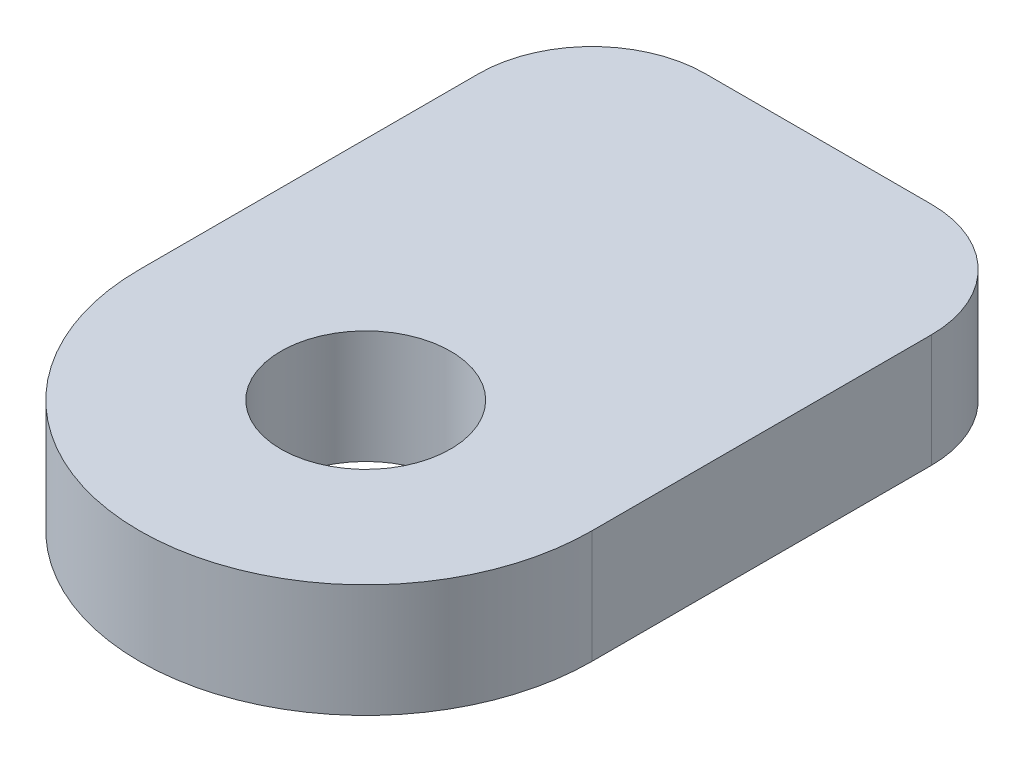
ISO-10303-21;
HEADER;
FILE_DESCRIPTION(('STEP AP214'),'2;1');
FILE_NAME('part.step','',(''),(''),'','','');
FILE_SCHEMA(('AUTOMOTIVE_DESIGN { 1 0 10303 214 1 1 1 1 }'));
ENDSEC;
DATA;
#1=APPLICATION_CONTEXT('core data for automotive mechanical design processes');
#2=APPLICATION_PROTOCOL_DEFINITION('international standard','automotive_design',2000,#1);
#3=PRODUCT_CONTEXT('',#1,'mechanical');
#4=PRODUCT('Part','Part','',(#3));
#5=PRODUCT_RELATED_PRODUCT_CATEGORY('part','',(#4));
#6=PRODUCT_DEFINITION_FORMATION('','',#4);
#7=PRODUCT_DEFINITION_CONTEXT('part definition',#1,'design');
#8=PRODUCT_DEFINITION('design','',#6,#7);
#9=PRODUCT_DEFINITION_SHAPE('','',#8);
#10=(LENGTH_UNIT() NAMED_UNIT(*) SI_UNIT(.MILLI.,.METRE.));
#11=(NAMED_UNIT(*) PLANE_ANGLE_UNIT() SI_UNIT($,.RADIAN.));
#12=(NAMED_UNIT(*) SI_UNIT($,.STERADIAN.) SOLID_ANGLE_UNIT());
#13=UNCERTAINTY_MEASURE_WITH_UNIT(LENGTH_MEASURE(1.E-05),#10,'distance_accuracy_value','');
#14=(GEOMETRIC_REPRESENTATION_CONTEXT(3) GLOBAL_UNCERTAINTY_ASSIGNED_CONTEXT((#13)) GLOBAL_UNIT_ASSIGNED_CONTEXT((#10,
#11,#12)) REPRESENTATION_CONTEXT('',''));
#15=CARTESIAN_POINT('',(0.,0.,0.));
#16=DIRECTION('',(0.,0.,1.));
#17=DIRECTION('',(1.,0.,0.));
#18=AXIS2_PLACEMENT_3D('',#15,#16,#17);
#19=CARTESIAN_POINT('',(0.,4.,0.));
#20=DIRECTION('',(0.,1.,0.));
#21=DIRECTION('',(0.,0.,1.));
#22=AXIS2_PLACEMENT_3D('',#19,#20,#21);
#23=PLANE('',#22);
#24=DIRECTION('',(0.,0.,-1.));
#25=VECTOR('',#24,1.);
#26=CARTESIAN_POINT('',(8.00000000000001,4.,0.));
#27=LINE('',#26,#25);
#28=CARTESIAN_POINT('',(8.00000000000001,4.,0.));
#29=VERTEX_POINT('',#28);
#30=CARTESIAN_POINT('',(8.,4.,-12.));
#31=VERTEX_POINT('',#30);
#32=EDGE_CURVE('E86',#29,#31,#27,.T.);
#33=ORIENTED_EDGE('',*,*,#32,.T.);
#34=CARTESIAN_POINT('',(4.,4.,-12.));
#35=DIRECTION('',(0.,1.,0.));
#36=DIRECTION('',(0.,0.,1.));
#37=AXIS2_PLACEMENT_3D('',#34,#35,#36);
#38=CIRCLE('',#37,4.);
#39=CARTESIAN_POINT('',(4.,4.,-16.));
#40=VERTEX_POINT('',#39);
#41=EDGE_CURVE('E41',#31,#40,#38,.T.);
#42=ORIENTED_EDGE('',*,*,#41,.T.);
#43=DIRECTION('',(-1.,0.,0.));
#44=VECTOR('',#43,1.);
#45=CARTESIAN_POINT('',(-8.,4.,-16.));
#46=LINE('',#45,#44);
#47=CARTESIAN_POINT('',(-4.,4.,-16.));
#48=VERTEX_POINT('',#47);
#49=EDGE_CURVE('E93',#40,#48,#46,.T.);
#50=ORIENTED_EDGE('',*,*,#49,.T.);
#51=CARTESIAN_POINT('',(-4.,4.,-12.));
#52=DIRECTION('',(0.,1.,0.));
#53=DIRECTION('',(0.,0.,1.));
#54=AXIS2_PLACEMENT_3D('',#51,#52,#53);
#55=CIRCLE('',#54,4.);
#56=CARTESIAN_POINT('',(-8.,4.,-12.));
#57=VERTEX_POINT('',#56);
#58=EDGE_CURVE('E48',#48,#57,#55,.T.);
#59=ORIENTED_EDGE('',*,*,#58,.T.);
#60=DIRECTION('',(0.,0.,1.));
#61=VECTOR('',#60,1.);
#62=CARTESIAN_POINT('',(-7.99999999999999,4.,0.));
#63=LINE('',#62,#61);
#64=CARTESIAN_POINT('',(-7.99999999999999,4.,0.));
#65=VERTEX_POINT('',#64);
#66=EDGE_CURVE('E98',#57,#65,#63,.T.);
#67=ORIENTED_EDGE('',*,*,#66,.T.);
#68=CARTESIAN_POINT('',(0.,4.,0.));
#69=DIRECTION('',(0.,1.,0.));
#70=DIRECTION('',(0.,0.,1.));
#71=AXIS2_PLACEMENT_3D('',#68,#69,#70);
#72=CIRCLE('',#71,8.);
#73=EDGE_CURVE('E94',#65,#29,#72,.T.);
#74=ORIENTED_EDGE('',*,*,#73,.T.);
#75=EDGE_LOOP('',(#33,#42,#50,#59,#67,#74));
#76=FACE_BOUND('',#75,.T.);
#77=CARTESIAN_POINT('',(0.,4.,0.));
#78=DIRECTION('',(0.,1.,0.));
#79=DIRECTION('',(0.,0.,1.));
#80=AXIS2_PLACEMENT_3D('',#77,#78,#79);
#81=CIRCLE('',#80,3.);
#82=CARTESIAN_POINT('',(0.,4.,3.));
#83=VERTEX_POINT('',#82);
#84=EDGE_CURVE('E139',#83,#83,#81,.T.);
#85=ORIENTED_EDGE('',*,*,#84,.F.);
#86=EDGE_LOOP('',(#85));
#87=FACE_BOUND('',#86,.T.);
#88=ADVANCED_FACE('F33',(#76,#87),#23,.T.);
#89=CARTESIAN_POINT('',(0.,0.,0.));
#90=DIRECTION('',(0.,1.,0.));
#91=DIRECTION('',(0.,0.,1.));
#92=AXIS2_PLACEMENT_3D('',#89,#90,#91);
#93=PLANE('',#92);
#94=DIRECTION('',(-1.,0.,0.));
#95=VECTOR('',#94,1.);
#96=CARTESIAN_POINT('',(-8.,0.,-16.));
#97=LINE('',#96,#95);
#98=CARTESIAN_POINT('',(4.,0.,-16.));
#99=VERTEX_POINT('',#98);
#100=CARTESIAN_POINT('',(-4.,0.,-16.));
#101=VERTEX_POINT('',#100);
#102=EDGE_CURVE('E136',#99,#101,#97,.T.);
#103=ORIENTED_EDGE('',*,*,#102,.F.);
#104=CARTESIAN_POINT('',(4.,0.,-12.));
#105=DIRECTION('',(0.,1.,0.));
#106=DIRECTION('',(0.,0.,1.));
#107=AXIS2_PLACEMENT_3D('',#104,#105,#106);
#108=CIRCLE('',#107,4.);
#109=CARTESIAN_POINT('',(8.,0.,-12.));
#110=VERTEX_POINT('',#109);
#111=EDGE_CURVE('E119',#99,#110,#108,.F.);
#112=ORIENTED_EDGE('',*,*,#111,.T.);
#113=DIRECTION('',(0.,0.,-1.));
#114=VECTOR('',#113,1.);
#115=CARTESIAN_POINT('',(8.00000000000001,0.,0.));
#116=LINE('',#115,#114);
#117=CARTESIAN_POINT('',(8.00000000000001,0.,0.));
#118=VERTEX_POINT('',#117);
#119=EDGE_CURVE('E135',#118,#110,#116,.T.);
#120=ORIENTED_EDGE('',*,*,#119,.F.);
#121=CARTESIAN_POINT('',(0.,0.,0.));
#122=DIRECTION('',(0.,1.,0.));
#123=DIRECTION('',(0.,0.,1.));
#124=AXIS2_PLACEMENT_3D('',#121,#122,#123);
#125=CIRCLE('',#124,8.);
#126=CARTESIAN_POINT('',(-7.99999999999999,0.,0.));
#127=VERTEX_POINT('',#126);
#128=EDGE_CURVE('E106',#127,#118,#125,.T.);
#129=ORIENTED_EDGE('',*,*,#128,.F.);
#130=DIRECTION('',(0.,0.,1.));
#131=VECTOR('',#130,1.);
#132=CARTESIAN_POINT('',(-7.99999999999999,0.,0.));
#133=LINE('',#132,#131);
#134=CARTESIAN_POINT('',(-8.,0.,-12.));
#135=VERTEX_POINT('',#134);
#136=EDGE_CURVE('E102',#135,#127,#133,.T.);
#137=ORIENTED_EDGE('',*,*,#136,.F.);
#138=CARTESIAN_POINT('',(-4.,0.,-12.));
#139=DIRECTION('',(0.,1.,0.));
#140=DIRECTION('',(0.,0.,1.));
#141=AXIS2_PLACEMENT_3D('',#138,#139,#140);
#142=CIRCLE('',#141,4.);
#143=EDGE_CURVE('E117',#135,#101,#142,.F.);
#144=ORIENTED_EDGE('',*,*,#143,.T.);
#145=EDGE_LOOP('',(#103,#112,#120,#129,#137,#144));
#146=FACE_BOUND('',#145,.T.);
#147=CARTESIAN_POINT('',(0.,0.,0.));
#148=DIRECTION('',(0.,1.,0.));
#149=DIRECTION('',(0.,0.,1.));
#150=AXIS2_PLACEMENT_3D('',#147,#148,#149);
#151=CIRCLE('',#150,3.);
#152=CARTESIAN_POINT('',(0.,0.,3.));
#153=VERTEX_POINT('',#152);
#154=EDGE_CURVE('E224',#153,#153,#151,.T.);
#155=ORIENTED_EDGE('',*,*,#154,.T.);
#156=EDGE_LOOP('',(#155));
#157=FACE_BOUND('',#156,.T.);
#158=ADVANCED_FACE('F133',(#146,#157),#93,.F.);
#159=CARTESIAN_POINT('',(0.,4.,0.));
#160=DIRECTION('',(0.,-1.,0.));
#161=DIRECTION('',(0.,0.,-1.));
#162=AXIS2_PLACEMENT_3D('',#159,#160,#161);
#163=CYLINDRICAL_SURFACE('',#162,8.);
#164=ORIENTED_EDGE('',*,*,#128,.T.);
#165=DIRECTION('',(0.,-1.,0.));
#166=VECTOR('',#165,1.);
#167=CARTESIAN_POINT('',(8.00000000000001,4.,0.));
#168=LINE('',#167,#166);
#169=EDGE_CURVE('E90',#29,#118,#168,.T.);
#170=ORIENTED_EDGE('',*,*,#169,.F.);
#171=ORIENTED_EDGE('',*,*,#73,.F.);
#172=DIRECTION('',(0.,-1.,0.));
#173=VECTOR('',#172,1.);
#174=CARTESIAN_POINT('',(-7.99999999999999,4.,0.));
#175=LINE('',#174,#173);
#176=EDGE_CURVE('E108',#65,#127,#175,.T.);
#177=ORIENTED_EDGE('',*,*,#176,.T.);
#178=EDGE_LOOP('',(#164,#170,#171,#177));
#179=FACE_BOUND('',#178,.T.);
#180=ADVANCED_FACE('F104',(#179),#163,.T.);
#181=CARTESIAN_POINT('',(8.00000000000001,4.,0.));
#182=DIRECTION('',(-1.,0.,0.));
#183=DIRECTION('',(0.,0.,1.));
#184=AXIS2_PLACEMENT_3D('',#181,#182,#183);
#185=PLANE('',#184);
#186=ORIENTED_EDGE('',*,*,#119,.T.);
#187=DIRECTION('',(0.,-1.,0.));
#188=VECTOR('',#187,1.);
#189=CARTESIAN_POINT('',(8.,4.,-12.));
#190=LINE('',#189,#188);
#191=EDGE_CURVE('E56',#110,#31,#190,.F.);
#192=ORIENTED_EDGE('',*,*,#191,.T.);
#193=ORIENTED_EDGE('',*,*,#32,.F.);
#194=ORIENTED_EDGE('',*,*,#169,.T.);
#195=EDGE_LOOP('',(#186,#192,#193,#194));
#196=FACE_BOUND('',#195,.T.);
#197=ADVANCED_FACE('F88',(#196),#185,.F.);
#198=CARTESIAN_POINT('',(-8.,4.,-16.));
#199=DIRECTION('',(0.,0.,1.));
#200=DIRECTION('',(1.,0.,0.));
#201=AXIS2_PLACEMENT_3D('',#198,#199,#200);
#202=PLANE('',#201);
#203=ORIENTED_EDGE('',*,*,#49,.F.);
#204=DIRECTION('',(0.,-1.,0.));
#205=VECTOR('',#204,1.);
#206=CARTESIAN_POINT('',(4.,4.,-16.));
#207=LINE('',#206,#205);
#208=EDGE_CURVE('E110',#40,#99,#207,.T.);
#209=ORIENTED_EDGE('',*,*,#208,.T.);
#210=ORIENTED_EDGE('',*,*,#102,.T.);
#211=DIRECTION('',(0.,-1.,0.));
#212=VECTOR('',#211,1.);
#213=CARTESIAN_POINT('',(-4.,4.,-16.));
#214=LINE('',#213,#212);
#215=EDGE_CURVE('E107',#101,#48,#214,.F.);
#216=ORIENTED_EDGE('',*,*,#215,.T.);
#217=EDGE_LOOP('',(#203,#209,#210,#216));
#218=FACE_BOUND('',#217,.T.);
#219=ADVANCED_FACE('F126',(#218),#202,.F.);
#220=CARTESIAN_POINT('',(-7.99999999999999,4.,0.));
#221=DIRECTION('',(1.,0.,0.));
#222=DIRECTION('',(0.,0.,-1.));
#223=AXIS2_PLACEMENT_3D('',#220,#221,#222);
#224=PLANE('',#223);
#225=ORIENTED_EDGE('',*,*,#66,.F.);
#226=DIRECTION('',(0.,-1.,0.));
#227=VECTOR('',#226,1.);
#228=CARTESIAN_POINT('',(-8.,4.,-12.));
#229=LINE('',#228,#227);
#230=EDGE_CURVE('E11',#57,#135,#229,.T.);
#231=ORIENTED_EDGE('',*,*,#230,.T.);
#232=ORIENTED_EDGE('',*,*,#136,.T.);
#233=ORIENTED_EDGE('',*,*,#176,.F.);
#234=EDGE_LOOP('',(#225,#231,#232,#233));
#235=FACE_BOUND('',#234,.T.);
#236=ADVANCED_FACE('F144',(#235),#224,.F.);
#237=CARTESIAN_POINT('',(0.,4.,0.));
#238=DIRECTION('',(0.,-1.,0.));
#239=DIRECTION('',(0.,0.,-1.));
#240=AXIS2_PLACEMENT_3D('',#237,#238,#239);
#241=CYLINDRICAL_SURFACE('',#240,3.);
#242=ORIENTED_EDGE('',*,*,#84,.T.);
#243=EDGE_LOOP('',(#242));
#244=FACE_BOUND('',#243,.T.);
#245=ORIENTED_EDGE('',*,*,#154,.F.);
#246=EDGE_LOOP('',(#245));
#247=FACE_BOUND('',#246,.T.);
#248=ADVANCED_FACE('F151',(#244,#247),#241,.F.);
#249=CARTESIAN_POINT('',(4.,4.,-12.));
#250=DIRECTION('',(0.,-1.,0.));
#251=DIRECTION('',(0.,0.,-1.));
#252=AXIS2_PLACEMENT_3D('',#249,#250,#251);
#253=CYLINDRICAL_SURFACE('',#252,4.);
#254=ORIENTED_EDGE('',*,*,#41,.F.);
#255=ORIENTED_EDGE('',*,*,#191,.F.);
#256=ORIENTED_EDGE('',*,*,#111,.F.);
#257=ORIENTED_EDGE('',*,*,#208,.F.);
#258=EDGE_LOOP('',(#254,#255,#256,#257));
#259=FACE_BOUND('',#258,.T.);
#260=ADVANCED_FACE('F131',(#259),#253,.T.);
#261=CARTESIAN_POINT('',(-4.,4.,-12.));
#262=DIRECTION('',(0.,-1.,0.));
#263=DIRECTION('',(0.,0.,-1.));
#264=AXIS2_PLACEMENT_3D('',#261,#262,#263);
#265=CYLINDRICAL_SURFACE('',#264,4.);
#266=ORIENTED_EDGE('',*,*,#58,.F.);
#267=ORIENTED_EDGE('',*,*,#215,.F.);
#268=ORIENTED_EDGE('',*,*,#143,.F.);
#269=ORIENTED_EDGE('',*,*,#230,.F.);
#270=EDGE_LOOP('',(#266,#267,#268,#269));
#271=FACE_BOUND('',#270,.T.);
#272=ADVANCED_FACE('F35',(#271),#265,.T.);
#273=CLOSED_SHELL('',(#88,#158,#180,#197,#219,#236,#248,#260,#272));
#274=MANIFOLD_SOLID_BREP('B2',#273);
#275=ADVANCED_BREP_SHAPE_REPRESENTATION('',(#18,#274),#14);
#276=SHAPE_DEFINITION_REPRESENTATION(#9,#275);
ENDSEC;
END-ISO-10303-21;
